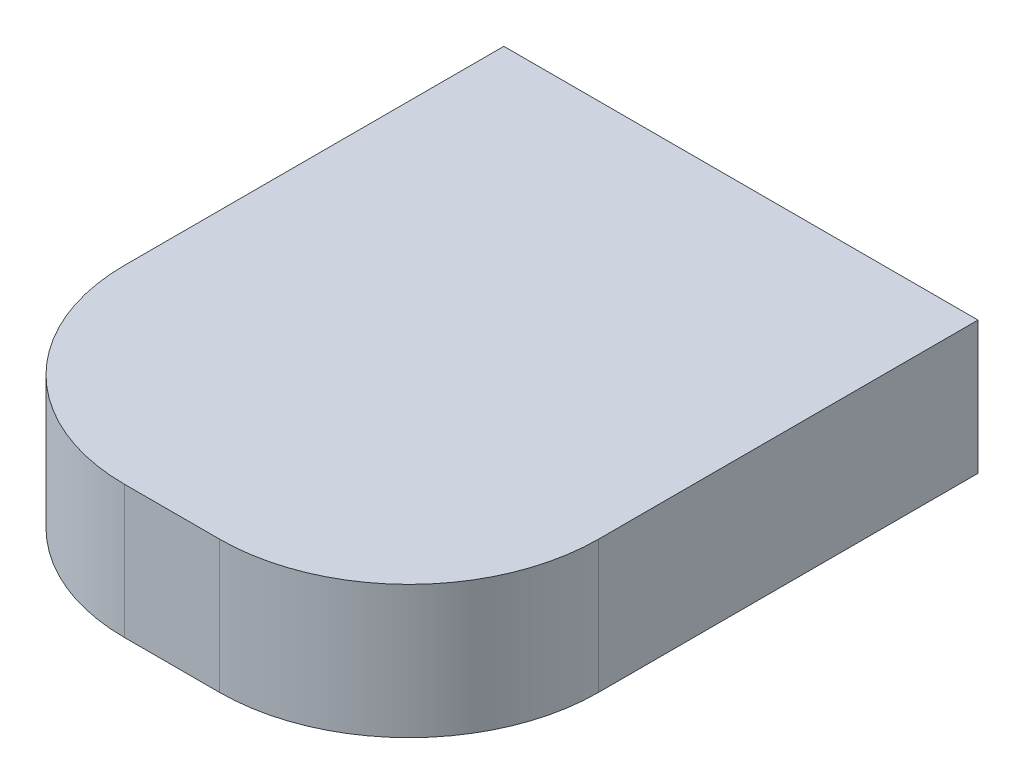
ISO-10303-21;
HEADER;
FILE_DESCRIPTION(('STEP AP214'),'2;1');
FILE_NAME('part.step','',(''),(''),'','','');
FILE_SCHEMA(('AUTOMOTIVE_DESIGN { 1 0 10303 214 1 1 1 1 }'));
ENDSEC;
DATA;
#1=APPLICATION_CONTEXT('core data for automotive mechanical design processes');
#2=APPLICATION_PROTOCOL_DEFINITION('international standard','automotive_design',2000,#1);
#3=PRODUCT_CONTEXT('',#1,'mechanical');
#4=PRODUCT('Part','Part','',(#3));
#5=PRODUCT_RELATED_PRODUCT_CATEGORY('part','',(#4));
#6=PRODUCT_DEFINITION_FORMATION('','',#4);
#7=PRODUCT_DEFINITION_CONTEXT('part definition',#1,'design');
#8=PRODUCT_DEFINITION('design','',#6,#7);
#9=PRODUCT_DEFINITION_SHAPE('','',#8);
#10=(LENGTH_UNIT() NAMED_UNIT(*) SI_UNIT(.MILLI.,.METRE.));
#11=(NAMED_UNIT(*) PLANE_ANGLE_UNIT() SI_UNIT($,.RADIAN.));
#12=(NAMED_UNIT(*) SI_UNIT($,.STERADIAN.) SOLID_ANGLE_UNIT());
#13=UNCERTAINTY_MEASURE_WITH_UNIT(LENGTH_MEASURE(1.E-05),#10,'distance_accuracy_value','');
#14=(GEOMETRIC_REPRESENTATION_CONTEXT(3) GLOBAL_UNCERTAINTY_ASSIGNED_CONTEXT((#13)) GLOBAL_UNIT_ASSIGNED_CONTEXT((#10,
#11,#12)) REPRESENTATION_CONTEXT('',''));
#15=CARTESIAN_POINT('',(0.,0.,0.));
#16=DIRECTION('',(0.,0.,1.));
#17=DIRECTION('',(1.,0.,0.));
#18=AXIS2_PLACEMENT_3D('',#15,#16,#17);
#19=CARTESIAN_POINT('',(-12.5,7.,-15.));
#20=DIRECTION('',(1.,0.,0.));
#21=DIRECTION('',(0.,0.,-1.));
#22=AXIS2_PLACEMENT_3D('',#19,#20,#21);
#23=PLANE('',#22);
#24=DIRECTION('',(0.,0.,1.));
#25=VECTOR('',#24,1.);
#26=CARTESIAN_POINT('',(-12.5,0.,-15.));
#27=LINE('',#26,#25);
#28=CARTESIAN_POINT('',(-12.5,0.,-15.));
#29=VERTEX_POINT('',#28);
#30=CARTESIAN_POINT('',(-12.5,0.,5.));
#31=VERTEX_POINT('',#30);
#32=EDGE_CURVE('E114',#29,#31,#27,.T.);
#33=ORIENTED_EDGE('',*,*,#32,.T.);
#34=DIRECTION('',(0.,-1.,0.));
#35=VECTOR('',#34,1.);
#36=CARTESIAN_POINT('',(-12.5,7.,5.));
#37=LINE('',#36,#35);
#38=CARTESIAN_POINT('',(-12.5,7.,5.));
#39=VERTEX_POINT('',#38);
#40=EDGE_CURVE('E128',#31,#39,#37,.F.);
#41=ORIENTED_EDGE('',*,*,#40,.T.);
#42=DIRECTION('',(0.,0.,1.));
#43=VECTOR('',#42,1.);
#44=CARTESIAN_POINT('',(-12.5,7.,-15.));
#45=LINE('',#44,#43);
#46=CARTESIAN_POINT('',(-12.5,7.,-15.));
#47=VERTEX_POINT('',#46);
#48=EDGE_CURVE('E122',#47,#39,#45,.T.);
#49=ORIENTED_EDGE('',*,*,#48,.F.);
#50=DIRECTION('',(0.,-1.,0.));
#51=VECTOR('',#50,1.);
#52=CARTESIAN_POINT('',(-12.5,7.,-15.));
#53=LINE('',#52,#51);
#54=EDGE_CURVE('E105',#47,#29,#53,.T.);
#55=ORIENTED_EDGE('',*,*,#54,.T.);
#56=EDGE_LOOP('',(#33,#41,#49,#55));
#57=FACE_BOUND('',#56,.T.);
#58=ADVANCED_FACE('F33',(#57),#23,.F.);
#59=CARTESIAN_POINT('',(12.5,7.,15.));
#60=DIRECTION('',(0.,0.,-1.));
#61=DIRECTION('',(-1.,0.,0.));
#62=AXIS2_PLACEMENT_3D('',#59,#60,#61);
#63=PLANE('',#62);
#64=DIRECTION('',(1.,0.,0.));
#65=VECTOR('',#64,1.);
#66=CARTESIAN_POINT('',(12.5,0.,15.));
#67=LINE('',#66,#65);
#68=CARTESIAN_POINT('',(-2.5,0.,15.));
#69=VERTEX_POINT('',#68);
#70=CARTESIAN_POINT('',(2.5,0.,15.));
#71=VERTEX_POINT('',#70);
#72=EDGE_CURVE('E117',#69,#71,#67,.T.);
#73=ORIENTED_EDGE('',*,*,#72,.T.);
#74=DIRECTION('',(0.,-1.,0.));
#75=VECTOR('',#74,1.);
#76=CARTESIAN_POINT('',(2.5,7.,15.));
#77=LINE('',#76,#75);
#78=CARTESIAN_POINT('',(2.5,7.,15.));
#79=VERTEX_POINT('',#78);
#80=EDGE_CURVE('E41',#71,#79,#77,.F.);
#81=ORIENTED_EDGE('',*,*,#80,.T.);
#82=DIRECTION('',(1.,0.,0.));
#83=VECTOR('',#82,1.);
#84=CARTESIAN_POINT('',(12.5,7.,15.));
#85=LINE('',#84,#83);
#86=CARTESIAN_POINT('',(-2.5,7.,15.));
#87=VERTEX_POINT('',#86);
#88=EDGE_CURVE('E96',#87,#79,#85,.T.);
#89=ORIENTED_EDGE('',*,*,#88,.F.);
#90=DIRECTION('',(0.,-1.,0.));
#91=VECTOR('',#90,1.);
#92=CARTESIAN_POINT('',(-2.5,7.,15.));
#93=LINE('',#92,#91);
#94=EDGE_CURVE('E104',#87,#69,#93,.T.);
#95=ORIENTED_EDGE('',*,*,#94,.T.);
#96=EDGE_LOOP('',(#73,#81,#89,#95));
#97=FACE_BOUND('',#96,.T.);
#98=ADVANCED_FACE('F162',(#97),#63,.F.);
#99=CARTESIAN_POINT('',(12.5,7.,-15.));
#100=DIRECTION('',(-1.,0.,0.));
#101=DIRECTION('',(0.,0.,1.));
#102=AXIS2_PLACEMENT_3D('',#99,#100,#101);
#103=PLANE('',#102);
#104=DIRECTION('',(0.,0.,-1.));
#105=VECTOR('',#104,1.);
#106=CARTESIAN_POINT('',(12.5,7.,-15.));
#107=LINE('',#106,#105);
#108=CARTESIAN_POINT('',(12.5,7.,5.));
#109=VERTEX_POINT('',#108);
#110=CARTESIAN_POINT('',(12.5,7.,-15.));
#111=VERTEX_POINT('',#110);
#112=EDGE_CURVE('E85',#109,#111,#107,.T.);
#113=ORIENTED_EDGE('',*,*,#112,.F.);
#114=DIRECTION('',(0.,-1.,0.));
#115=VECTOR('',#114,1.);
#116=CARTESIAN_POINT('',(12.5,7.,5.));
#117=LINE('',#116,#115);
#118=CARTESIAN_POINT('',(12.5,0.,5.));
#119=VERTEX_POINT('',#118);
#120=EDGE_CURVE('E132',#109,#119,#117,.T.);
#121=ORIENTED_EDGE('',*,*,#120,.T.);
#122=DIRECTION('',(0.,0.,-1.));
#123=VECTOR('',#122,1.);
#124=CARTESIAN_POINT('',(12.5,0.,-15.));
#125=LINE('',#124,#123);
#126=CARTESIAN_POINT('',(12.5,0.,-15.));
#127=VERTEX_POINT('',#126);
#128=EDGE_CURVE('E101',#119,#127,#125,.T.);
#129=ORIENTED_EDGE('',*,*,#128,.T.);
#130=DIRECTION('',(0.,-1.,0.));
#131=VECTOR('',#130,1.);
#132=CARTESIAN_POINT('',(12.5,7.,-15.));
#133=LINE('',#132,#131);
#134=EDGE_CURVE('E99',#111,#127,#133,.T.);
#135=ORIENTED_EDGE('',*,*,#134,.F.);
#136=EDGE_LOOP('',(#113,#121,#129,#135));
#137=FACE_BOUND('',#136,.T.);
#138=ADVANCED_FACE('F100',(#137),#103,.F.);
#139=CARTESIAN_POINT('',(12.5,7.,-15.));
#140=DIRECTION('',(0.,0.,1.));
#141=DIRECTION('',(1.,0.,0.));
#142=AXIS2_PLACEMENT_3D('',#139,#140,#141);
#143=PLANE('',#142);
#144=DIRECTION('',(-1.,0.,0.));
#145=VECTOR('',#144,1.);
#146=CARTESIAN_POINT('',(12.5,0.,-15.));
#147=LINE('',#146,#145);
#148=EDGE_CURVE('E121',#127,#29,#147,.T.);
#149=ORIENTED_EDGE('',*,*,#148,.T.);
#150=ORIENTED_EDGE('',*,*,#54,.F.);
#151=DIRECTION('',(-1.,0.,0.));
#152=VECTOR('',#151,1.);
#153=CARTESIAN_POINT('',(12.5,7.,-15.));
#154=LINE('',#153,#152);
#155=EDGE_CURVE('E90',#111,#47,#154,.T.);
#156=ORIENTED_EDGE('',*,*,#155,.F.);
#157=ORIENTED_EDGE('',*,*,#134,.T.);
#158=EDGE_LOOP('',(#149,#150,#156,#157));
#159=FACE_BOUND('',#158,.T.);
#160=ADVANCED_FACE('F107',(#159),#143,.F.);
#161=CARTESIAN_POINT('',(0.,7.,0.));
#162=DIRECTION('',(0.,-1.,0.));
#163=DIRECTION('',(0.,0.,-1.));
#164=AXIS2_PLACEMENT_3D('',#161,#162,#163);
#165=PLANE('',#164);
#166=ORIENTED_EDGE('',*,*,#88,.T.);
#167=CARTESIAN_POINT('',(2.5,7.,5.));
#168=DIRECTION('',(0.,-1.,0.));
#169=DIRECTION('',(0.,0.,-1.));
#170=AXIS2_PLACEMENT_3D('',#167,#168,#169);
#171=CIRCLE('',#170,10.);
#172=EDGE_CURVE('E11',#79,#109,#171,.F.);
#173=ORIENTED_EDGE('',*,*,#172,.T.);
#174=ORIENTED_EDGE('',*,*,#112,.T.);
#175=ORIENTED_EDGE('',*,*,#155,.T.);
#176=ORIENTED_EDGE('',*,*,#48,.T.);
#177=CARTESIAN_POINT('',(-2.5,7.,5.));
#178=DIRECTION('',(0.,-1.,0.));
#179=DIRECTION('',(0.,0.,-1.));
#180=AXIS2_PLACEMENT_3D('',#177,#178,#179);
#181=CIRCLE('',#180,10.);
#182=EDGE_CURVE('E130',#39,#87,#181,.F.);
#183=ORIENTED_EDGE('',*,*,#182,.T.);
#184=EDGE_LOOP('',(#166,#173,#174,#175,#176,#183));
#185=FACE_BOUND('',#184,.T.);
#186=ADVANCED_FACE('F87',(#185),#165,.F.);
#187=CARTESIAN_POINT('',(0.,0.,0.));
#188=DIRECTION('',(0.,-1.,0.));
#189=DIRECTION('',(0.,0.,-1.));
#190=AXIS2_PLACEMENT_3D('',#187,#188,#189);
#191=PLANE('',#190);
#192=CARTESIAN_POINT('',(0.,0.,3.));
#193=DIRECTION('',(0.,1.,0.));
#194=DIRECTION('',(0.,0.,1.));
#195=AXIS2_PLACEMENT_3D('',#192,#193,#194);
#196=CIRCLE('',#195,10.);
#197=CARTESIAN_POINT('',(0.,0.,13.));
#198=VERTEX_POINT('',#197);
#199=EDGE_CURVE('E142',#198,#198,#196,.T.);
#200=ORIENTED_EDGE('',*,*,#199,.T.);
#201=EDGE_LOOP('',(#200));
#202=FACE_BOUND('',#201,.T.);
#203=ORIENTED_EDGE('',*,*,#128,.F.);
#204=CARTESIAN_POINT('',(2.5,0.,5.));
#205=DIRECTION('',(0.,-1.,0.));
#206=DIRECTION('',(0.,0.,-1.));
#207=AXIS2_PLACEMENT_3D('',#204,#205,#206);
#208=CIRCLE('',#207,10.);
#209=EDGE_CURVE('E55',#119,#71,#208,.T.);
#210=ORIENTED_EDGE('',*,*,#209,.T.);
#211=ORIENTED_EDGE('',*,*,#72,.F.);
#212=CARTESIAN_POINT('',(-2.5,0.,5.));
#213=DIRECTION('',(0.,-1.,0.));
#214=DIRECTION('',(0.,0.,-1.));
#215=AXIS2_PLACEMENT_3D('',#212,#213,#214);
#216=CIRCLE('',#215,10.);
#217=EDGE_CURVE('E126',#69,#31,#216,.T.);
#218=ORIENTED_EDGE('',*,*,#217,.T.);
#219=ORIENTED_EDGE('',*,*,#32,.F.);
#220=ORIENTED_EDGE('',*,*,#148,.F.);
#221=EDGE_LOOP('',(#203,#210,#211,#218,#219,#220));
#222=FACE_BOUND('',#221,.T.);
#223=ADVANCED_FACE('F135',(#202,#222),#191,.T.);
#224=CARTESIAN_POINT('',(0.,3.,3.));
#225=DIRECTION('',(0.,-1.,0.));
#226=DIRECTION('',(0.,0.,-1.));
#227=AXIS2_PLACEMENT_3D('',#224,#225,#226);
#228=CYLINDRICAL_SURFACE('',#227,10.);
#229=CARTESIAN_POINT('',(0.,3.,3.));
#230=DIRECTION('',(0.,1.,0.));
#231=DIRECTION('',(0.,0.,1.));
#232=AXIS2_PLACEMENT_3D('',#229,#230,#231);
#233=CIRCLE('',#232,10.);
#234=CARTESIAN_POINT('',(0.,3.,13.));
#235=VERTEX_POINT('',#234);
#236=EDGE_CURVE('E118',#235,#235,#233,.T.);
#237=ORIENTED_EDGE('',*,*,#236,.T.);
#238=EDGE_LOOP('',(#237));
#239=FACE_BOUND('',#238,.T.);
#240=ORIENTED_EDGE('',*,*,#199,.F.);
#241=EDGE_LOOP('',(#240));
#242=FACE_BOUND('',#241,.T.);
#243=ADVANCED_FACE('F148',(#239,#242),#228,.F.);
#244=CARTESIAN_POINT('',(0.,3.,3.));
#245=DIRECTION('',(0.,1.,0.));
#246=DIRECTION('',(0.,0.,1.));
#247=AXIS2_PLACEMENT_3D('',#244,#245,#246);
#248=PLANE('',#247);
#249=ORIENTED_EDGE('',*,*,#236,.F.);
#250=EDGE_LOOP('',(#249));
#251=FACE_BOUND('',#250,.T.);
#252=ADVANCED_FACE('F151',(#251),#248,.F.);
#253=CARTESIAN_POINT('',(-2.5,7.,5.));
#254=DIRECTION('',(0.,-1.,0.));
#255=DIRECTION('',(0.,0.,-1.));
#256=AXIS2_PLACEMENT_3D('',#253,#254,#255);
#257=CYLINDRICAL_SURFACE('',#256,10.);
#258=ORIENTED_EDGE('',*,*,#182,.F.);
#259=ORIENTED_EDGE('',*,*,#40,.F.);
#260=ORIENTED_EDGE('',*,*,#217,.F.);
#261=ORIENTED_EDGE('',*,*,#94,.F.);
#262=EDGE_LOOP('',(#258,#259,#260,#261));
#263=FACE_BOUND('',#262,.T.);
#264=ADVANCED_FACE('F153',(#263),#257,.T.);
#265=CARTESIAN_POINT('',(2.5,7.,5.));
#266=DIRECTION('',(0.,-1.,0.));
#267=DIRECTION('',(0.,0.,-1.));
#268=AXIS2_PLACEMENT_3D('',#265,#266,#267);
#269=CYLINDRICAL_SURFACE('',#268,10.);
#270=ORIENTED_EDGE('',*,*,#172,.F.);
#271=ORIENTED_EDGE('',*,*,#80,.F.);
#272=ORIENTED_EDGE('',*,*,#209,.F.);
#273=ORIENTED_EDGE('',*,*,#120,.F.);
#274=EDGE_LOOP('',(#270,#271,#272,#273));
#275=FACE_BOUND('',#274,.T.);
#276=ADVANCED_FACE('F35',(#275),#269,.T.);
#277=CLOSED_SHELL('',(#58,#98,#138,#160,#186,#223,#243,#252,#264,#276));
#278=MANIFOLD_SOLID_BREP('B2',#277);
#279=ADVANCED_BREP_SHAPE_REPRESENTATION('',(#18,#278),#14);
#280=SHAPE_DEFINITION_REPRESENTATION(#9,#279);
ENDSEC;
END-ISO-10303-21;
